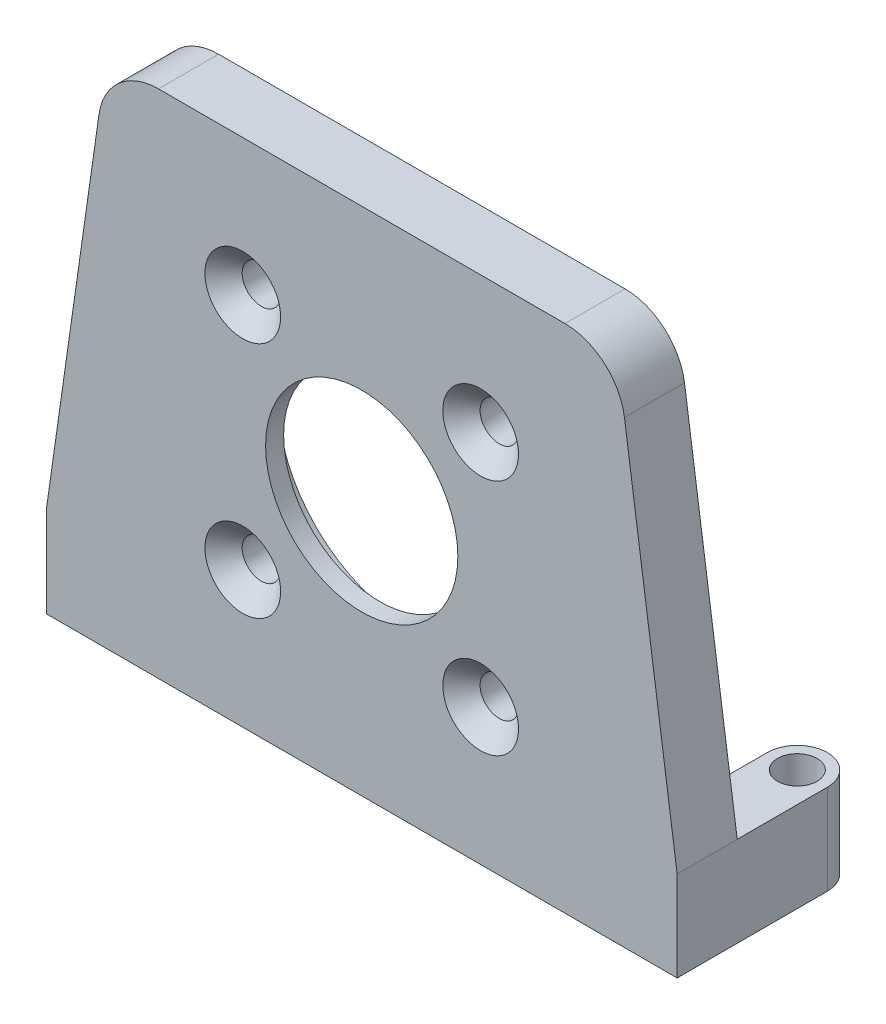
ISO-10303-21;
HEADER;
FILE_DESCRIPTION(('STEP AP214'),'2;1');
FILE_NAME('part.step','',(''),(''),'','','');
FILE_SCHEMA(('AUTOMOTIVE_DESIGN { 1 0 10303 214 1 1 1 1 }'));
ENDSEC;
DATA;
#1=APPLICATION_CONTEXT('core data for automotive mechanical design processes');
#2=APPLICATION_PROTOCOL_DEFINITION('international standard','automotive_design',2000,#1);
#3=PRODUCT_CONTEXT('',#1,'mechanical');
#4=PRODUCT('Part','Part','',(#3));
#5=PRODUCT_RELATED_PRODUCT_CATEGORY('part','',(#4));
#6=PRODUCT_DEFINITION_FORMATION('','',#4);
#7=PRODUCT_DEFINITION_CONTEXT('part definition',#1,'design');
#8=PRODUCT_DEFINITION('design','',#6,#7);
#9=PRODUCT_DEFINITION_SHAPE('','',#8);
#10=(LENGTH_UNIT() NAMED_UNIT(*) SI_UNIT(.MILLI.,.METRE.));
#11=(NAMED_UNIT(*) PLANE_ANGLE_UNIT() SI_UNIT($,.RADIAN.));
#12=(NAMED_UNIT(*) SI_UNIT($,.STERADIAN.) SOLID_ANGLE_UNIT());
#13=UNCERTAINTY_MEASURE_WITH_UNIT(LENGTH_MEASURE(1.E-05),#10,'distance_accuracy_value','');
#14=(GEOMETRIC_REPRESENTATION_CONTEXT(3) GLOBAL_UNCERTAINTY_ASSIGNED_CONTEXT((#13)) GLOBAL_UNIT_ASSIGNED_CONTEXT((#10,
#11,#12)) REPRESENTATION_CONTEXT('',''));
#15=CARTESIAN_POINT('',(0.,0.,0.));
#16=DIRECTION('',(0.,0.,1.));
#17=DIRECTION('',(1.,0.,0.));
#18=AXIS2_PLACEMENT_3D('',#15,#16,#17);
#19=CARTESIAN_POINT('',(26.25,21.25,5.));
#20=DIRECTION('',(0.,0.,-1.));
#21=DIRECTION('',(-1.,0.,0.));
#22=AXIS2_PLACEMENT_3D('',#19,#20,#21);
#23=CYLINDRICAL_SURFACE('',#22,8.);
#24=CARTESIAN_POINT('',(26.25,21.25,5.));
#25=DIRECTION('',(0.,0.,1.));
#26=DIRECTION('',(1.,0.,0.));
#27=AXIS2_PLACEMENT_3D('',#24,#25,#26);
#28=CIRCLE('',#27,8.);
#29=CARTESIAN_POINT('',(34.25,21.25,5.));
#30=VERTEX_POINT('',#29);
#31=EDGE_CURVE('E252',#30,#30,#28,.T.);
#32=ORIENTED_EDGE('',*,*,#31,.T.);
#33=EDGE_LOOP('',(#32));
#34=FACE_BOUND('',#33,.T.);
#35=CARTESIAN_POINT('',(26.25,21.25,3.5));
#36=DIRECTION('',(0.,0.,-1.));
#37=DIRECTION('',(-1.,0.,0.));
#38=AXIS2_PLACEMENT_3D('',#35,#36,#37);
#39=CIRCLE('',#38,8.);
#40=CARTESIAN_POINT('',(18.25,21.25,3.5));
#41=VERTEX_POINT('',#40);
#42=EDGE_CURVE('E51',#41,#41,#39,.T.);
#43=ORIENTED_EDGE('',*,*,#42,.T.);
#44=EDGE_LOOP('',(#43));
#45=FACE_BOUND('',#44,.T.);
#46=ADVANCED_FACE('F47',(#34,#45),#23,.F.);
#47=CARTESIAN_POINT('',(36.1494949366117,31.1494949366117,5.));
#48=DIRECTION('',(0.,0.,1.));
#49=DIRECTION('',(1.,0.,0.));
#50=AXIS2_PLACEMENT_3D('',#47,#48,#49);
#51=CYLINDRICAL_SURFACE('',#50,1.6);
#52=CARTESIAN_POINT('',(36.1494949366117,31.1494949366117,3.45));
#53=DIRECTION('',(0.,0.,1.));
#54=DIRECTION('',(1.,0.,0.));
#55=AXIS2_PLACEMENT_3D('',#52,#53,#54);
#56=CIRCLE('',#55,1.6);
#57=CARTESIAN_POINT('',(37.7494949366117,31.1494949366117,3.45));
#58=VERTEX_POINT('',#57);
#59=EDGE_CURVE('E200',#58,#58,#56,.T.);
#60=ORIENTED_EDGE('',*,*,#59,.T.);
#61=EDGE_LOOP('',(#60));
#62=FACE_BOUND('',#61,.T.);
#63=CARTESIAN_POINT('',(36.1494949366117,31.1494949366117,1.));
#64=DIRECTION('',(0.,0.,-1.));
#65=DIRECTION('',(-1.,0.,0.));
#66=AXIS2_PLACEMENT_3D('',#63,#64,#65);
#67=CIRCLE('',#66,1.6);
#68=CARTESIAN_POINT('',(34.5494949366117,31.1494949366117,1.));
#69=VERTEX_POINT('',#68);
#70=EDGE_CURVE('E480',#69,#69,#67,.F.);
#71=ORIENTED_EDGE('',*,*,#70,.F.);
#72=EDGE_LOOP('',(#71));
#73=FACE_BOUND('',#72,.T.);
#74=ADVANCED_FACE('F387',(#62,#73),#51,.F.);
#75=CARTESIAN_POINT('',(16.3505050633883,11.3505050633883,5.));
#76=DIRECTION('',(0.,0.,1.));
#77=DIRECTION('',(1.,0.,0.));
#78=AXIS2_PLACEMENT_3D('',#75,#76,#77);
#79=CYLINDRICAL_SURFACE('',#78,1.6);
#80=CARTESIAN_POINT('',(16.3505050633883,11.3505050633883,3.45));
#81=DIRECTION('',(0.,0.,1.));
#82=DIRECTION('',(1.,0.,0.));
#83=AXIS2_PLACEMENT_3D('',#80,#81,#82);
#84=CIRCLE('',#83,1.6);
#85=CARTESIAN_POINT('',(17.9505050633883,11.3505050633883,3.45));
#86=VERTEX_POINT('',#85);
#87=EDGE_CURVE('E194',#86,#86,#84,.T.);
#88=ORIENTED_EDGE('',*,*,#87,.T.);
#89=EDGE_LOOP('',(#88));
#90=FACE_BOUND('',#89,.T.);
#91=CARTESIAN_POINT('',(16.3505050633883,11.3505050633883,1.));
#92=DIRECTION('',(0.,0.,-1.));
#93=DIRECTION('',(-1.,0.,0.));
#94=AXIS2_PLACEMENT_3D('',#91,#92,#93);
#95=CIRCLE('',#94,1.6);
#96=CARTESIAN_POINT('',(14.7505050633883,11.3505050633883,1.));
#97=VERTEX_POINT('',#96);
#98=EDGE_CURVE('E478',#97,#97,#95,.F.);
#99=ORIENTED_EDGE('',*,*,#98,.F.);
#100=EDGE_LOOP('',(#99));
#101=FACE_BOUND('',#100,.T.);
#102=ADVANCED_FACE('F393',(#90,#101),#79,.F.);
#103=CARTESIAN_POINT('',(36.1494949366117,11.3505050633883,5.));
#104=DIRECTION('',(0.,0.,1.));
#105=DIRECTION('',(1.,0.,0.));
#106=AXIS2_PLACEMENT_3D('',#103,#104,#105);
#107=CYLINDRICAL_SURFACE('',#106,1.6);
#108=CARTESIAN_POINT('',(36.1494949366117,11.3505050633883,3.45));
#109=DIRECTION('',(0.,0.,1.));
#110=DIRECTION('',(1.,0.,0.));
#111=AXIS2_PLACEMENT_3D('',#108,#109,#110);
#112=CIRCLE('',#111,1.6);
#113=CARTESIAN_POINT('',(37.7494949366117,11.3505050633883,3.45));
#114=VERTEX_POINT('',#113);
#115=EDGE_CURVE('E188',#114,#114,#112,.T.);
#116=ORIENTED_EDGE('',*,*,#115,.T.);
#117=EDGE_LOOP('',(#116));
#118=FACE_BOUND('',#117,.T.);
#119=CARTESIAN_POINT('',(36.1494949366117,11.3505050633883,1.));
#120=DIRECTION('',(0.,0.,-1.));
#121=DIRECTION('',(-1.,0.,0.));
#122=AXIS2_PLACEMENT_3D('',#119,#120,#121);
#123=CIRCLE('',#122,1.6);
#124=CARTESIAN_POINT('',(34.5494949366117,11.3505050633883,1.));
#125=VERTEX_POINT('',#124);
#126=EDGE_CURVE('E481',#125,#125,#123,.F.);
#127=ORIENTED_EDGE('',*,*,#126,.F.);
#128=EDGE_LOOP('',(#127));
#129=FACE_BOUND('',#128,.T.);
#130=ADVANCED_FACE('F459',(#118,#129),#107,.F.);
#131=CARTESIAN_POINT('',(16.3505050633883,31.1494949366117,5.));
#132=DIRECTION('',(0.,0.,1.));
#133=DIRECTION('',(1.,0.,0.));
#134=AXIS2_PLACEMENT_3D('',#131,#132,#133);
#135=CYLINDRICAL_SURFACE('',#134,1.6);
#136=CARTESIAN_POINT('',(16.3505050633883,31.1494949366117,3.45));
#137=DIRECTION('',(0.,0.,1.));
#138=DIRECTION('',(1.,0.,0.));
#139=AXIS2_PLACEMENT_3D('',#136,#137,#138);
#140=CIRCLE('',#139,1.6);
#141=CARTESIAN_POINT('',(17.9505050633883,31.1494949366117,3.45));
#142=VERTEX_POINT('',#141);
#143=EDGE_CURVE('E182',#142,#142,#140,.T.);
#144=ORIENTED_EDGE('',*,*,#143,.T.);
#145=EDGE_LOOP('',(#144));
#146=FACE_BOUND('',#145,.T.);
#147=CARTESIAN_POINT('',(16.3505050633883,31.1494949366117,1.));
#148=DIRECTION('',(0.,0.,-1.));
#149=DIRECTION('',(-1.,0.,0.));
#150=AXIS2_PLACEMENT_3D('',#147,#148,#149);
#151=CIRCLE('',#150,1.6);
#152=CARTESIAN_POINT('',(14.7505050633883,31.1494949366117,1.));
#153=VERTEX_POINT('',#152);
#154=EDGE_CURVE('E266',#153,#153,#151,.F.);
#155=ORIENTED_EDGE('',*,*,#154,.F.);
#156=EDGE_LOOP('',(#155));
#157=FACE_BOUND('',#156,.T.);
#158=ADVANCED_FACE('F406',(#146,#157),#135,.F.);
#159=CARTESIAN_POINT('',(9.33647700847534,37.5,0.));
#160=DIRECTION('',(0.,0.,-1.));
#161=DIRECTION('',(-1.,0.,0.));
#162=AXIS2_PLACEMENT_3D('',#159,#160,#161);
#163=PLANE('',#162);
#164=CARTESIAN_POINT('',(26.25,21.25,0.));
#165=DIRECTION('',(0.,0.,-1.));
#166=DIRECTION('',(-1.,0.,0.));
#167=AXIS2_PLACEMENT_3D('',#164,#165,#166);
#168=CIRCLE('',#167,18.25);
#169=CARTESIAN_POINT('',(8.,21.25,0.));
#170=VERTEX_POINT('',#169);
#171=EDGE_CURVE('E535',#170,#170,#168,.T.);
#172=ORIENTED_EDGE('',*,*,#171,.F.);
#173=EDGE_LOOP('',(#172));
#174=FACE_BOUND('',#173,.T.);
#175=DIRECTION('',(0.,-1.,0.));
#176=VECTOR('',#175,1.);
#177=CARTESIAN_POINT('',(5.,7.5,0.));
#178=LINE('',#177,#176);
#179=CARTESIAN_POINT('',(5.,7.5,0.));
#180=VERTEX_POINT('',#179);
#181=CARTESIAN_POINT('',(5.,0.,0.));
#182=VERTEX_POINT('',#181);
#183=EDGE_CURVE('E224',#180,#182,#178,.T.);
#184=ORIENTED_EDGE('',*,*,#183,.F.);
#185=DIRECTION('',(-1.,0.,0.));
#186=VECTOR('',#185,1.);
#187=CARTESIAN_POINT('',(0.,7.5,0.));
#188=LINE('',#187,#186);
#189=CARTESIAN_POINT('',(0.,7.5,0.));
#190=VERTEX_POINT('',#189);
#191=EDGE_CURVE('E215',#180,#190,#188,.T.);
#192=ORIENTED_EDGE('',*,*,#191,.T.);
#193=DIRECTION('',(-0.14142135623731,-0.989949493661166,0.));
#194=VECTOR('',#193,1.);
#195=CARTESIAN_POINT('',(0.,7.5,0.));
#196=LINE('',#195,#194);
#197=CARTESIAN_POINT('',(4.38672954016951,38.2071067811866,0.));
#198=VERTEX_POINT('',#197);
#199=EDGE_CURVE('E279',#198,#190,#196,.T.);
#200=ORIENTED_EDGE('',*,*,#199,.F.);
#201=CARTESIAN_POINT('',(9.33647700847534,37.5,0.));
#202=DIRECTION('',(0.,0.,1.));
#203=DIRECTION('',(-1.,0.,0.));
#204=AXIS2_PLACEMENT_3D('',#201,#202,#203);
#205=CIRCLE('',#204,5.);
#206=CARTESIAN_POINT('',(9.33647700847534,42.5,0.));
#207=VERTEX_POINT('',#206);
#208=EDGE_CURVE('E277',#207,#198,#205,.T.);
#209=ORIENTED_EDGE('',*,*,#208,.F.);
#210=DIRECTION('',(-1.,0.,0.));
#211=VECTOR('',#210,1.);
#212=CARTESIAN_POINT('',(9.33647700847534,42.5,0.));
#213=LINE('',#212,#211);
#214=CARTESIAN_POINT('',(43.1635229915247,42.5,0.));
#215=VERTEX_POINT('',#214);
#216=EDGE_CURVE('E275',#215,#207,#213,.T.);
#217=ORIENTED_EDGE('',*,*,#216,.F.);
#218=CARTESIAN_POINT('',(43.1635229915247,37.5,0.));
#219=DIRECTION('',(0.,0.,1.));
#220=DIRECTION('',(1.,0.,0.));
#221=AXIS2_PLACEMENT_3D('',#218,#219,#220);
#222=CIRCLE('',#221,5.);
#223=CARTESIAN_POINT('',(48.1132704598305,38.2071067811866,0.));
#224=VERTEX_POINT('',#223);
#225=EDGE_CURVE('E273',#224,#215,#222,.T.);
#226=ORIENTED_EDGE('',*,*,#225,.F.);
#227=DIRECTION('',(-0.141421356237309,0.989949493661166,0.));
#228=VECTOR('',#227,1.);
#229=CARTESIAN_POINT('',(52.5,7.5,0.));
#230=LINE('',#229,#228);
#231=CARTESIAN_POINT('',(52.5,7.5,0.));
#232=VERTEX_POINT('',#231);
#233=EDGE_CURVE('E265',#232,#224,#230,.T.);
#234=ORIENTED_EDGE('',*,*,#233,.F.);
#235=DIRECTION('',(-1.,0.,0.));
#236=VECTOR('',#235,1.);
#237=CARTESIAN_POINT('',(52.5,7.5,0.));
#238=LINE('',#237,#236);
#239=CARTESIAN_POINT('',(47.5,7.5,0.));
#240=VERTEX_POINT('',#239);
#241=EDGE_CURVE('E236',#232,#240,#238,.T.);
#242=ORIENTED_EDGE('',*,*,#241,.T.);
#243=DIRECTION('',(0.,-1.,0.));
#244=VECTOR('',#243,1.);
#245=CARTESIAN_POINT('',(47.5,7.5,0.));
#246=LINE('',#245,#244);
#247=CARTESIAN_POINT('',(47.5,0.,0.));
#248=VERTEX_POINT('',#247);
#249=EDGE_CURVE('E246',#240,#248,#246,.T.);
#250=ORIENTED_EDGE('',*,*,#249,.T.);
#251=DIRECTION('',(1.,0.,0.));
#252=VECTOR('',#251,1.);
#253=CARTESIAN_POINT('',(0.,0.,0.));
#254=LINE('',#253,#252);
#255=EDGE_CURVE('E70',#182,#248,#254,.T.);
#256=ORIENTED_EDGE('',*,*,#255,.F.);
#257=EDGE_LOOP('',(#184,#192,#200,#209,#217,#226,#234,#242,#250,#256));
#258=FACE_BOUND('',#257,.T.);
#259=ADVANCED_FACE('F321',(#174,#258),#163,.T.);
#260=CARTESIAN_POINT('',(9.33647700847534,37.5,5.));
#261=DIRECTION('',(0.,0.,-1.));
#262=DIRECTION('',(-1.,0.,0.));
#263=AXIS2_PLACEMENT_3D('',#260,#261,#262);
#264=PLANE('',#263);
#265=CARTESIAN_POINT('',(16.3505050633883,31.1494949366117,5.));
#266=DIRECTION('',(0.,0.,1.));
#267=DIRECTION('',(1.,0.,0.));
#268=AXIS2_PLACEMENT_3D('',#265,#266,#267);
#269=CIRCLE('',#268,3.15);
#270=CARTESIAN_POINT('',(19.5005050633883,31.1494949366117,5.));
#271=VERTEX_POINT('',#270);
#272=EDGE_CURVE('E179',#271,#271,#269,.T.);
#273=ORIENTED_EDGE('',*,*,#272,.F.);
#274=EDGE_LOOP('',(#273));
#275=FACE_BOUND('',#274,.T.);
#276=CARTESIAN_POINT('',(36.1494949366117,11.3505050633883,5.));
#277=DIRECTION('',(0.,0.,1.));
#278=DIRECTION('',(1.,0.,0.));
#279=AXIS2_PLACEMENT_3D('',#276,#277,#278);
#280=CIRCLE('',#279,3.15);
#281=CARTESIAN_POINT('',(39.2994949366117,11.3505050633883,5.));
#282=VERTEX_POINT('',#281);
#283=EDGE_CURVE('E185',#282,#282,#280,.T.);
#284=ORIENTED_EDGE('',*,*,#283,.F.);
#285=EDGE_LOOP('',(#284));
#286=FACE_BOUND('',#285,.T.);
#287=CARTESIAN_POINT('',(16.3505050633883,11.3505050633883,5.));
#288=DIRECTION('',(0.,0.,1.));
#289=DIRECTION('',(1.,0.,0.));
#290=AXIS2_PLACEMENT_3D('',#287,#288,#289);
#291=CIRCLE('',#290,3.15);
#292=CARTESIAN_POINT('',(19.5005050633883,11.3505050633883,5.));
#293=VERTEX_POINT('',#292);
#294=EDGE_CURVE('E191',#293,#293,#291,.T.);
#295=ORIENTED_EDGE('',*,*,#294,.F.);
#296=EDGE_LOOP('',(#295));
#297=FACE_BOUND('',#296,.T.);
#298=CARTESIAN_POINT('',(36.1494949366117,31.1494949366117,5.));
#299=DIRECTION('',(0.,0.,1.));
#300=DIRECTION('',(1.,0.,0.));
#301=AXIS2_PLACEMENT_3D('',#298,#299,#300);
#302=CIRCLE('',#301,3.15);
#303=CARTESIAN_POINT('',(39.2994949366117,31.1494949366117,5.));
#304=VERTEX_POINT('',#303);
#305=EDGE_CURVE('E197',#304,#304,#302,.T.);
#306=ORIENTED_EDGE('',*,*,#305,.F.);
#307=EDGE_LOOP('',(#306));
#308=FACE_BOUND('',#307,.T.);
#309=DIRECTION('',(0.,-1.,0.));
#310=VECTOR('',#309,1.);
#311=CARTESIAN_POINT('',(0.,0.,5.));
#312=LINE('',#311,#310);
#313=CARTESIAN_POINT('',(0.,7.5,5.));
#314=VERTEX_POINT('',#313);
#315=CARTESIAN_POINT('',(0.,0.,5.));
#316=VERTEX_POINT('',#315);
#317=EDGE_CURVE('E283',#314,#316,#312,.T.);
#318=ORIENTED_EDGE('',*,*,#317,.T.);
#319=DIRECTION('',(1.,0.,0.));
#320=VECTOR('',#319,1.);
#321=CARTESIAN_POINT('',(0.,0.,5.));
#322=LINE('',#321,#320);
#323=CARTESIAN_POINT('',(52.5,0.,5.));
#324=VERTEX_POINT('',#323);
#325=EDGE_CURVE('E358',#316,#324,#322,.T.);
#326=ORIENTED_EDGE('',*,*,#325,.T.);
#327=DIRECTION('',(0.,1.,0.));
#328=VECTOR('',#327,1.);
#329=CARTESIAN_POINT('',(52.5,0.,5.));
#330=LINE('',#329,#328);
#331=CARTESIAN_POINT('',(52.5,7.5,5.));
#332=VERTEX_POINT('',#331);
#333=EDGE_CURVE('E340',#324,#332,#330,.T.);
#334=ORIENTED_EDGE('',*,*,#333,.T.);
#335=DIRECTION('',(-0.141421356237309,0.989949493661166,0.));
#336=VECTOR('',#335,1.);
#337=CARTESIAN_POINT('',(52.5,7.5,5.));
#338=LINE('',#337,#336);
#339=CARTESIAN_POINT('',(48.1132704598305,38.2071067811866,5.));
#340=VERTEX_POINT('',#339);
#341=EDGE_CURVE('E336',#332,#340,#338,.T.);
#342=ORIENTED_EDGE('',*,*,#341,.T.);
#343=CARTESIAN_POINT('',(43.1635229915247,37.5,5.));
#344=DIRECTION('',(0.,0.,1.));
#345=DIRECTION('',(1.,0.,0.));
#346=AXIS2_PLACEMENT_3D('',#343,#344,#345);
#347=CIRCLE('',#346,5.);
#348=CARTESIAN_POINT('',(43.1635229915247,42.5,5.));
#349=VERTEX_POINT('',#348);
#350=EDGE_CURVE('E332',#340,#349,#347,.T.);
#351=ORIENTED_EDGE('',*,*,#350,.T.);
#352=DIRECTION('',(-1.,0.,0.));
#353=VECTOR('',#352,1.);
#354=CARTESIAN_POINT('',(9.33647700847534,42.5,5.));
#355=LINE('',#354,#353);
#356=CARTESIAN_POINT('',(9.33647700847534,42.5,5.));
#357=VERTEX_POINT('',#356);
#358=EDGE_CURVE('E335',#349,#357,#355,.T.);
#359=ORIENTED_EDGE('',*,*,#358,.T.);
#360=CARTESIAN_POINT('',(9.33647700847534,37.5,5.));
#361=DIRECTION('',(0.,0.,1.));
#362=DIRECTION('',(-1.,0.,0.));
#363=AXIS2_PLACEMENT_3D('',#360,#361,#362);
#364=CIRCLE('',#363,5.);
#365=CARTESIAN_POINT('',(4.38672954016951,38.2071067811866,5.));
#366=VERTEX_POINT('',#365);
#367=EDGE_CURVE('E338',#357,#366,#364,.T.);
#368=ORIENTED_EDGE('',*,*,#367,.T.);
#369=DIRECTION('',(-0.14142135623731,-0.989949493661166,0.));
#370=VECTOR('',#369,1.);
#371=CARTESIAN_POINT('',(0.,7.5,5.));
#372=LINE('',#371,#370);
#373=EDGE_CURVE('E270',#366,#314,#372,.T.);
#374=ORIENTED_EDGE('',*,*,#373,.T.);
#375=EDGE_LOOP('',(#318,#326,#334,#342,#351,#359,#368,#374));
#376=FACE_BOUND('',#375,.T.);
#377=ORIENTED_EDGE('',*,*,#31,.F.);
#378=EDGE_LOOP('',(#377));
#379=FACE_BOUND('',#378,.T.);
#380=ADVANCED_FACE('F350',(#275,#286,#297,#308,#376,#379),#264,.F.);
#381=CARTESIAN_POINT('',(0.,0.,5.));
#382=DIRECTION('',(1.,0.,0.));
#383=DIRECTION('',(0.,0.,-1.));
#384=AXIS2_PLACEMENT_3D('',#381,#382,#383);
#385=PLANE('',#384);
#386=DIRECTION('',(0.,0.,-1.));
#387=VECTOR('',#386,1.);
#388=CARTESIAN_POINT('',(0.,7.5,5.));
#389=LINE('',#388,#387);
#390=EDGE_CURVE('E284',#314,#190,#389,.T.);
#391=ORIENTED_EDGE('',*,*,#390,.T.);
#392=DIRECTION('',(0.,0.,-1.));
#393=VECTOR('',#392,1.);
#394=CARTESIAN_POINT('',(0.,7.5,0.));
#395=LINE('',#394,#393);
#396=CARTESIAN_POINT('',(0.,7.5,-7.5));
#397=VERTEX_POINT('',#396);
#398=EDGE_CURVE('E204',#190,#397,#395,.T.);
#399=ORIENTED_EDGE('',*,*,#398,.T.);
#400=DIRECTION('',(0.,-1.,0.));
#401=VECTOR('',#400,1.);
#402=CARTESIAN_POINT('',(0.,7.5,-7.5));
#403=LINE('',#402,#401);
#404=CARTESIAN_POINT('',(0.,0.,-7.5));
#405=VERTEX_POINT('',#404);
#406=EDGE_CURVE('E219',#397,#405,#403,.T.);
#407=ORIENTED_EDGE('',*,*,#406,.T.);
#408=DIRECTION('',(0.,0.,-1.));
#409=VECTOR('',#408,1.);
#410=CARTESIAN_POINT('',(0.,0.,5.));
#411=LINE('',#410,#409);
#412=EDGE_CURVE('E11',#316,#405,#411,.T.);
#413=ORIENTED_EDGE('',*,*,#412,.F.);
#414=ORIENTED_EDGE('',*,*,#317,.F.);
#415=EDGE_LOOP('',(#391,#399,#407,#413,#414));
#416=FACE_BOUND('',#415,.T.);
#417=ADVANCED_FACE('F49',(#416),#385,.F.);
#418=CARTESIAN_POINT('',(0.,0.,5.));
#419=DIRECTION('',(0.,1.,0.));
#420=DIRECTION('',(0.,0.,1.));
#421=AXIS2_PLACEMENT_3D('',#418,#419,#420);
#422=PLANE('',#421);
#423=CARTESIAN_POINT('',(2.5,0.,-7.5));
#424=DIRECTION('',(0.,-1.,0.));
#425=DIRECTION('',(0.,0.,-1.));
#426=AXIS2_PLACEMENT_3D('',#423,#424,#425);
#427=CIRCLE('',#426,1.64999999999999);
#428=CARTESIAN_POINT('',(2.5,0.,-9.14999999999999));
#429=VERTEX_POINT('',#428);
#430=EDGE_CURVE('E431',#429,#429,#427,.T.);
#431=ORIENTED_EDGE('',*,*,#430,.F.);
#432=EDGE_LOOP('',(#431));
#433=FACE_BOUND('',#432,.T.);
#434=CARTESIAN_POINT('',(50.,0.,-7.5));
#435=DIRECTION('',(0.,-1.,0.));
#436=DIRECTION('',(0.,0.,-1.));
#437=AXIS2_PLACEMENT_3D('',#434,#435,#436);
#438=CIRCLE('',#437,1.64999999999999);
#439=CARTESIAN_POINT('',(50.,0.,-9.15));
#440=VERTEX_POINT('',#439);
#441=EDGE_CURVE('E435',#440,#440,#438,.T.);
#442=ORIENTED_EDGE('',*,*,#441,.F.);
#443=EDGE_LOOP('',(#442));
#444=FACE_BOUND('',#443,.T.);
#445=CARTESIAN_POINT('',(50.,0.,2.5));
#446=DIRECTION('',(0.,-1.,0.));
#447=DIRECTION('',(0.,0.,-1.));
#448=AXIS2_PLACEMENT_3D('',#445,#446,#447);
#449=CIRCLE('',#448,1.64999999999999);
#450=CARTESIAN_POINT('',(50.,0.,0.850000000000008));
#451=VERTEX_POINT('',#450);
#452=EDGE_CURVE('E166',#451,#451,#449,.T.);
#453=ORIENTED_EDGE('',*,*,#452,.F.);
#454=EDGE_LOOP('',(#453));
#455=FACE_BOUND('',#454,.T.);
#456=CARTESIAN_POINT('',(2.5,0.,2.5));
#457=DIRECTION('',(0.,-1.,0.));
#458=DIRECTION('',(0.,0.,-1.));
#459=AXIS2_PLACEMENT_3D('',#456,#457,#458);
#460=CIRCLE('',#459,1.64999999999999);
#461=CARTESIAN_POINT('',(2.5,0.,0.850000000000011));
#462=VERTEX_POINT('',#461);
#463=EDGE_CURVE('E165',#462,#462,#460,.T.);
#464=ORIENTED_EDGE('',*,*,#463,.F.);
#465=EDGE_LOOP('',(#464));
#466=FACE_BOUND('',#465,.T.);
#467=ORIENTED_EDGE('',*,*,#412,.T.);
#468=CARTESIAN_POINT('',(2.5,0.,-7.5));
#469=DIRECTION('',(0.,-1.,0.));
#470=DIRECTION('',(0.,0.,-1.));
#471=AXIS2_PLACEMENT_3D('',#468,#469,#470);
#472=CIRCLE('',#471,2.5);
#473=CARTESIAN_POINT('',(5.,0.,-7.5));
#474=VERTEX_POINT('',#473);
#475=EDGE_CURVE('E203',#405,#474,#472,.T.);
#476=ORIENTED_EDGE('',*,*,#475,.T.);
#477=DIRECTION('',(0.,0.,1.));
#478=VECTOR('',#477,1.);
#479=CARTESIAN_POINT('',(5.,0.,0.));
#480=LINE('',#479,#478);
#481=EDGE_CURVE('E65',#474,#182,#480,.T.);
#482=ORIENTED_EDGE('',*,*,#481,.T.);
#483=ORIENTED_EDGE('',*,*,#255,.T.);
#484=DIRECTION('',(0.,0.,-1.));
#485=VECTOR('',#484,1.);
#486=CARTESIAN_POINT('',(47.5,0.,0.));
#487=LINE('',#486,#485);
#488=CARTESIAN_POINT('',(47.5,0.,-7.5));
#489=VERTEX_POINT('',#488);
#490=EDGE_CURVE('E226',#248,#489,#487,.T.);
#491=ORIENTED_EDGE('',*,*,#490,.T.);
#492=CARTESIAN_POINT('',(50.,0.,-7.5));
#493=DIRECTION('',(0.,-1.,0.));
#494=DIRECTION('',(0.,0.,-1.));
#495=AXIS2_PLACEMENT_3D('',#492,#493,#494);
#496=CIRCLE('',#495,2.5);
#497=CARTESIAN_POINT('',(52.5,0.,-7.5));
#498=VERTEX_POINT('',#497);
#499=EDGE_CURVE('E237',#489,#498,#496,.T.);
#500=ORIENTED_EDGE('',*,*,#499,.T.);
#501=DIRECTION('',(0.,0.,-1.));
#502=VECTOR('',#501,1.);
#503=CARTESIAN_POINT('',(52.5,0.,5.));
#504=LINE('',#503,#502);
#505=EDGE_CURVE('E57',#324,#498,#504,.T.);
#506=ORIENTED_EDGE('',*,*,#505,.F.);
#507=ORIENTED_EDGE('',*,*,#325,.F.);
#508=EDGE_LOOP('',(#467,#476,#482,#483,#491,#500,#506,#507));
#509=FACE_BOUND('',#508,.T.);
#510=ADVANCED_FACE('F304',(#433,#444,#455,#466,#509),#422,.F.);
#511=CARTESIAN_POINT('',(52.5,0.,5.));
#512=DIRECTION('',(-1.,0.,0.));
#513=DIRECTION('',(0.,0.,1.));
#514=AXIS2_PLACEMENT_3D('',#511,#512,#513);
#515=PLANE('',#514);
#516=ORIENTED_EDGE('',*,*,#505,.T.);
#517=DIRECTION('',(0.,-1.,0.));
#518=VECTOR('',#517,1.);
#519=CARTESIAN_POINT('',(52.5,7.5,-7.5));
#520=LINE('',#519,#518);
#521=CARTESIAN_POINT('',(52.5,7.5,-7.5));
#522=VERTEX_POINT('',#521);
#523=EDGE_CURVE('E249',#522,#498,#520,.T.);
#524=ORIENTED_EDGE('',*,*,#523,.F.);
#525=DIRECTION('',(0.,0.,1.));
#526=VECTOR('',#525,1.);
#527=CARTESIAN_POINT('',(52.5,7.5,0.));
#528=LINE('',#527,#526);
#529=EDGE_CURVE('E233',#522,#232,#528,.T.);
#530=ORIENTED_EDGE('',*,*,#529,.T.);
#531=DIRECTION('',(0.,0.,-1.));
#532=VECTOR('',#531,1.);
#533=CARTESIAN_POINT('',(52.5,7.5,5.));
#534=LINE('',#533,#532);
#535=EDGE_CURVE('E300',#332,#232,#534,.T.);
#536=ORIENTED_EDGE('',*,*,#535,.F.);
#537=ORIENTED_EDGE('',*,*,#333,.F.);
#538=EDGE_LOOP('',(#516,#524,#530,#536,#537));
#539=FACE_BOUND('',#538,.T.);
#540=ADVANCED_FACE('F312',(#539),#515,.F.);
#541=CARTESIAN_POINT('',(52.5,7.5,5.));
#542=DIRECTION('',(-0.989949493661166,-0.141421356237309,0.));
#543=DIRECTION('',(0.141421356237309,-0.989949493661167,0.));
#544=AXIS2_PLACEMENT_3D('',#541,#542,#543);
#545=PLANE('',#544);
#546=ORIENTED_EDGE('',*,*,#233,.T.);
#547=DIRECTION('',(0.,0.,-1.));
#548=VECTOR('',#547,1.);
#549=CARTESIAN_POINT('',(48.1132704598305,38.2071067811866,5.));
#550=LINE('',#549,#548);
#551=EDGE_CURVE('E297',#340,#224,#550,.T.);
#552=ORIENTED_EDGE('',*,*,#551,.F.);
#553=ORIENTED_EDGE('',*,*,#341,.F.);
#554=ORIENTED_EDGE('',*,*,#535,.T.);
#555=EDGE_LOOP('',(#546,#552,#553,#554));
#556=FACE_BOUND('',#555,.T.);
#557=ADVANCED_FACE('F326',(#556),#545,.F.);
#558=CARTESIAN_POINT('',(43.1635229915247,37.5,5.));
#559=DIRECTION('',(0.,0.,-1.));
#560=DIRECTION('',(-1.,0.,0.));
#561=AXIS2_PLACEMENT_3D('',#558,#559,#560);
#562=CYLINDRICAL_SURFACE('',#561,5.);
#563=ORIENTED_EDGE('',*,*,#225,.T.);
#564=DIRECTION('',(0.,0.,-1.));
#565=VECTOR('',#564,1.);
#566=CARTESIAN_POINT('',(43.1635229915247,42.5,5.));
#567=LINE('',#566,#565);
#568=EDGE_CURVE('E294',#349,#215,#567,.T.);
#569=ORIENTED_EDGE('',*,*,#568,.F.);
#570=ORIENTED_EDGE('',*,*,#350,.F.);
#571=ORIENTED_EDGE('',*,*,#551,.T.);
#572=EDGE_LOOP('',(#563,#569,#570,#571));
#573=FACE_BOUND('',#572,.T.);
#574=ADVANCED_FACE('F330',(#573),#562,.T.);
#575=CARTESIAN_POINT('',(9.33647700847534,42.5,5.));
#576=DIRECTION('',(0.,-1.,0.));
#577=DIRECTION('',(0.,0.,-1.));
#578=AXIS2_PLACEMENT_3D('',#575,#576,#577);
#579=PLANE('',#578);
#580=ORIENTED_EDGE('',*,*,#216,.T.);
#581=DIRECTION('',(0.,0.,-1.));
#582=VECTOR('',#581,1.);
#583=CARTESIAN_POINT('',(9.33647700847534,42.5,5.));
#584=LINE('',#583,#582);
#585=EDGE_CURVE('E291',#357,#207,#584,.T.);
#586=ORIENTED_EDGE('',*,*,#585,.F.);
#587=ORIENTED_EDGE('',*,*,#358,.F.);
#588=ORIENTED_EDGE('',*,*,#568,.T.);
#589=EDGE_LOOP('',(#580,#586,#587,#588));
#590=FACE_BOUND('',#589,.T.);
#591=ADVANCED_FACE('F413',(#590),#579,.F.);
#592=CARTESIAN_POINT('',(9.33647700847534,37.5,5.));
#593=DIRECTION('',(0.,0.,-1.));
#594=DIRECTION('',(-1.,0.,0.));
#595=AXIS2_PLACEMENT_3D('',#592,#593,#594);
#596=CYLINDRICAL_SURFACE('',#595,5.);
#597=ORIENTED_EDGE('',*,*,#208,.T.);
#598=DIRECTION('',(0.,0.,-1.));
#599=VECTOR('',#598,1.);
#600=CARTESIAN_POINT('',(4.38672954016951,38.2071067811866,5.));
#601=LINE('',#600,#599);
#602=EDGE_CURVE('E288',#366,#198,#601,.T.);
#603=ORIENTED_EDGE('',*,*,#602,.F.);
#604=ORIENTED_EDGE('',*,*,#367,.F.);
#605=ORIENTED_EDGE('',*,*,#585,.T.);
#606=EDGE_LOOP('',(#597,#603,#604,#605));
#607=FACE_BOUND('',#606,.T.);
#608=ADVANCED_FACE('F410',(#607),#596,.T.);
#609=CARTESIAN_POINT('',(0.,7.5,5.));
#610=DIRECTION('',(0.989949493661166,-0.14142135623731,0.));
#611=DIRECTION('',(0.14142135623731,0.989949493661167,0.));
#612=AXIS2_PLACEMENT_3D('',#609,#610,#611);
#613=PLANE('',#612);
#614=ORIENTED_EDGE('',*,*,#199,.T.);
#615=ORIENTED_EDGE('',*,*,#390,.F.);
#616=ORIENTED_EDGE('',*,*,#373,.F.);
#617=ORIENTED_EDGE('',*,*,#602,.T.);
#618=EDGE_LOOP('',(#614,#615,#616,#617));
#619=FACE_BOUND('',#618,.T.);
#620=ADVANCED_FACE('F355',(#619),#613,.F.);
#621=CARTESIAN_POINT('',(50.,7.5,-7.5));
#622=DIRECTION('',(0.,-1.,0.));
#623=DIRECTION('',(0.,0.,-1.));
#624=AXIS2_PLACEMENT_3D('',#621,#622,#623);
#625=CYLINDRICAL_SURFACE('',#624,2.5);
#626=ORIENTED_EDGE('',*,*,#499,.F.);
#627=DIRECTION('',(0.,-1.,0.));
#628=VECTOR('',#627,1.);
#629=CARTESIAN_POINT('',(47.5,7.5,-7.5));
#630=LINE('',#629,#628);
#631=CARTESIAN_POINT('',(47.5,7.5,-7.5));
#632=VERTEX_POINT('',#631);
#633=EDGE_CURVE('E253',#632,#489,#630,.T.);
#634=ORIENTED_EDGE('',*,*,#633,.F.);
#635=CARTESIAN_POINT('',(50.,7.5,-7.5));
#636=DIRECTION('',(0.,-1.,0.));
#637=DIRECTION('',(0.,0.,-1.));
#638=AXIS2_PLACEMENT_3D('',#635,#636,#637);
#639=CIRCLE('',#638,2.5);
#640=EDGE_CURVE('E243',#632,#522,#639,.T.);
#641=ORIENTED_EDGE('',*,*,#640,.T.);
#642=ORIENTED_EDGE('',*,*,#523,.T.);
#643=EDGE_LOOP('',(#626,#634,#641,#642));
#644=FACE_BOUND('',#643,.T.);
#645=ADVANCED_FACE('F308',(#644),#625,.T.);
#646=CARTESIAN_POINT('',(47.5,7.5,0.));
#647=DIRECTION('',(-1.,0.,0.));
#648=DIRECTION('',(0.,0.,1.));
#649=AXIS2_PLACEMENT_3D('',#646,#647,#648);
#650=PLANE('',#649);
#651=ORIENTED_EDGE('',*,*,#490,.F.);
#652=ORIENTED_EDGE('',*,*,#249,.F.);
#653=DIRECTION('',(0.,0.,-1.));
#654=VECTOR('',#653,1.);
#655=CARTESIAN_POINT('',(47.5,7.5,0.));
#656=LINE('',#655,#654);
#657=EDGE_CURVE('E240',#240,#632,#656,.T.);
#658=ORIENTED_EDGE('',*,*,#657,.T.);
#659=ORIENTED_EDGE('',*,*,#633,.T.);
#660=EDGE_LOOP('',(#651,#652,#658,#659));
#661=FACE_BOUND('',#660,.T.);
#662=ADVANCED_FACE('F399',(#661),#650,.T.);
#663=CARTESIAN_POINT('',(50.,7.5,-7.5));
#664=DIRECTION('',(0.,-1.,0.));
#665=DIRECTION('',(0.,0.,-1.));
#666=AXIS2_PLACEMENT_3D('',#663,#664,#665);
#667=PLANE('',#666);
#668=CARTESIAN_POINT('',(50.,7.5,-7.5));
#669=DIRECTION('',(0.,-1.,0.));
#670=DIRECTION('',(0.,0.,-1.));
#671=AXIS2_PLACEMENT_3D('',#668,#669,#670);
#672=CIRCLE('',#671,1.65);
#673=CARTESIAN_POINT('',(50.,7.5,-9.15));
#674=VERTEX_POINT('',#673);
#675=EDGE_CURVE('E172',#674,#674,#672,.T.);
#676=ORIENTED_EDGE('',*,*,#675,.T.);
#677=EDGE_LOOP('',(#676));
#678=FACE_BOUND('',#677,.T.);
#679=ORIENTED_EDGE('',*,*,#529,.F.);
#680=ORIENTED_EDGE('',*,*,#640,.F.);
#681=ORIENTED_EDGE('',*,*,#657,.F.);
#682=ORIENTED_EDGE('',*,*,#241,.F.);
#683=EDGE_LOOP('',(#679,#680,#681,#682));
#684=FACE_BOUND('',#683,.T.);
#685=ADVANCED_FACE('F316',(#678,#684),#667,.F.);
#686=CARTESIAN_POINT('',(5.,7.5,0.));
#687=DIRECTION('',(1.,0.,0.));
#688=DIRECTION('',(0.,0.,-1.));
#689=AXIS2_PLACEMENT_3D('',#686,#687,#688);
#690=PLANE('',#689);
#691=ORIENTED_EDGE('',*,*,#481,.F.);
#692=DIRECTION('',(0.,-1.,0.));
#693=VECTOR('',#692,1.);
#694=CARTESIAN_POINT('',(5.,7.5,-7.5));
#695=LINE('',#694,#693);
#696=CARTESIAN_POINT('',(5.,7.5,-7.5));
#697=VERTEX_POINT('',#696);
#698=EDGE_CURVE('E227',#697,#474,#695,.T.);
#699=ORIENTED_EDGE('',*,*,#698,.F.);
#700=DIRECTION('',(0.,0.,1.));
#701=VECTOR('',#700,1.);
#702=CARTESIAN_POINT('',(5.,7.5,0.));
#703=LINE('',#702,#701);
#704=EDGE_CURVE('E212',#697,#180,#703,.T.);
#705=ORIENTED_EDGE('',*,*,#704,.T.);
#706=ORIENTED_EDGE('',*,*,#183,.T.);
#707=EDGE_LOOP('',(#691,#699,#705,#706));
#708=FACE_BOUND('',#707,.T.);
#709=ADVANCED_FACE('F366',(#708),#690,.T.);
#710=CARTESIAN_POINT('',(2.5,7.5,-7.5));
#711=DIRECTION('',(0.,-1.,0.));
#712=DIRECTION('',(0.,0.,-1.));
#713=AXIS2_PLACEMENT_3D('',#710,#711,#712);
#714=CYLINDRICAL_SURFACE('',#713,2.5);
#715=ORIENTED_EDGE('',*,*,#475,.F.);
#716=ORIENTED_EDGE('',*,*,#406,.F.);
#717=CARTESIAN_POINT('',(2.5,7.5,-7.5));
#718=DIRECTION('',(0.,-1.,0.));
#719=DIRECTION('',(0.,0.,-1.));
#720=AXIS2_PLACEMENT_3D('',#717,#718,#719);
#721=CIRCLE('',#720,2.5);
#722=EDGE_CURVE('E208',#397,#697,#721,.T.);
#723=ORIENTED_EDGE('',*,*,#722,.T.);
#724=ORIENTED_EDGE('',*,*,#698,.T.);
#725=EDGE_LOOP('',(#715,#716,#723,#724));
#726=FACE_BOUND('',#725,.T.);
#727=ADVANCED_FACE('F363',(#726),#714,.T.);
#728=CARTESIAN_POINT('',(2.5,7.5,-7.5));
#729=DIRECTION('',(0.,-1.,0.));
#730=DIRECTION('',(0.,0.,-1.));
#731=AXIS2_PLACEMENT_3D('',#728,#729,#730);
#732=PLANE('',#731);
#733=CARTESIAN_POINT('',(2.5,7.5,-7.5));
#734=DIRECTION('',(0.,-1.,0.));
#735=DIRECTION('',(0.,0.,-1.));
#736=AXIS2_PLACEMENT_3D('',#733,#734,#735);
#737=CIRCLE('',#736,1.64999999999999);
#738=CARTESIAN_POINT('',(2.5,7.5,-9.15));
#739=VERTEX_POINT('',#738);
#740=EDGE_CURVE('E491',#739,#739,#737,.T.);
#741=ORIENTED_EDGE('',*,*,#740,.T.);
#742=EDGE_LOOP('',(#741));
#743=FACE_BOUND('',#742,.T.);
#744=ORIENTED_EDGE('',*,*,#398,.F.);
#745=ORIENTED_EDGE('',*,*,#191,.F.);
#746=ORIENTED_EDGE('',*,*,#704,.F.);
#747=ORIENTED_EDGE('',*,*,#722,.F.);
#748=EDGE_LOOP('',(#744,#745,#746,#747));
#749=FACE_BOUND('',#748,.T.);
#750=ADVANCED_FACE('F370',(#743,#749),#732,.F.);
#751=CARTESIAN_POINT('',(36.1494949366117,31.1494949366117,5.));
#752=DIRECTION('',(0.,0.,1.));
#753=DIRECTION('',(1.,0.,0.));
#754=AXIS2_PLACEMENT_3D('',#751,#752,#753);
#755=CONICAL_SURFACE('',#754,3.15,0.785398163397449);
#756=ORIENTED_EDGE('',*,*,#59,.F.);
#757=EDGE_LOOP('',(#756));
#758=FACE_BOUND('',#757,.T.);
#759=ORIENTED_EDGE('',*,*,#305,.T.);
#760=EDGE_LOOP('',(#759));
#761=FACE_BOUND('',#760,.T.);
#762=ADVANCED_FACE('F372',(#758,#761),#755,.F.);
#763=CARTESIAN_POINT('',(16.3505050633883,11.3505050633883,5.));
#764=DIRECTION('',(0.,0.,1.));
#765=DIRECTION('',(1.,0.,0.));
#766=AXIS2_PLACEMENT_3D('',#763,#764,#765);
#767=CONICAL_SURFACE('',#766,3.15,0.785398163397448);
#768=ORIENTED_EDGE('',*,*,#87,.F.);
#769=EDGE_LOOP('',(#768));
#770=FACE_BOUND('',#769,.T.);
#771=ORIENTED_EDGE('',*,*,#294,.T.);
#772=EDGE_LOOP('',(#771));
#773=FACE_BOUND('',#772,.T.);
#774=ADVANCED_FACE('F379',(#770,#773),#767,.F.);
#775=CARTESIAN_POINT('',(36.1494949366117,11.3505050633883,5.));
#776=DIRECTION('',(0.,0.,1.));
#777=DIRECTION('',(1.,0.,0.));
#778=AXIS2_PLACEMENT_3D('',#775,#776,#777);
#779=CONICAL_SURFACE('',#778,3.15,0.785398163397449);
#780=ORIENTED_EDGE('',*,*,#115,.F.);
#781=EDGE_LOOP('',(#780));
#782=FACE_BOUND('',#781,.T.);
#783=ORIENTED_EDGE('',*,*,#283,.T.);
#784=EDGE_LOOP('',(#783));
#785=FACE_BOUND('',#784,.T.);
#786=ADVANCED_FACE('F455',(#782,#785),#779,.F.);
#787=CARTESIAN_POINT('',(16.3505050633883,31.1494949366117,5.));
#788=DIRECTION('',(0.,0.,1.));
#789=DIRECTION('',(1.,0.,0.));
#790=AXIS2_PLACEMENT_3D('',#787,#788,#789);
#791=CONICAL_SURFACE('',#790,3.15,0.785398163397448);
#792=ORIENTED_EDGE('',*,*,#143,.F.);
#793=EDGE_LOOP('',(#792));
#794=FACE_BOUND('',#793,.T.);
#795=ORIENTED_EDGE('',*,*,#272,.T.);
#796=EDGE_LOOP('',(#795));
#797=FACE_BOUND('',#796,.T.);
#798=ADVANCED_FACE('F447',(#794,#797),#791,.F.);
#799=CARTESIAN_POINT('',(2.5,13.,2.5));
#800=DIRECTION('',(0.,-1.,0.));
#801=DIRECTION('',(0.,0.,-1.));
#802=AXIS2_PLACEMENT_3D('',#799,#800,#801);
#803=CONICAL_SURFACE('',#802,1.65,1.02974425867665);
#804=CARTESIAN_POINT('',(2.5,13.9914200213955,2.5));
#805=VERTEX_POINT('',#804);
#806=VERTEX_LOOP('',#805);
#807=FACE_BOUND('',#806,.T.);
#808=CARTESIAN_POINT('',(2.5,13.,2.5));
#809=DIRECTION('',(0.,-1.,0.));
#810=DIRECTION('',(0.,0.,-1.));
#811=AXIS2_PLACEMENT_3D('',#808,#809,#810);
#812=CIRCLE('',#811,1.65);
#813=CARTESIAN_POINT('',(2.5,13.,0.850000000000004));
#814=VERTEX_POINT('',#813);
#815=EDGE_CURVE('E169',#814,#814,#812,.T.);
#816=ORIENTED_EDGE('',*,*,#815,.T.);
#817=EDGE_LOOP('',(#816));
#818=FACE_BOUND('',#817,.T.);
#819=ADVANCED_FACE('F441',(#807,#818),#803,.F.);
#820=CARTESIAN_POINT('',(2.5,0.,2.5));
#821=DIRECTION('',(0.,-1.,0.));
#822=DIRECTION('',(0.,0.,-1.));
#823=AXIS2_PLACEMENT_3D('',#820,#821,#822);
#824=CYLINDRICAL_SURFACE('',#823,1.64999999999999);
#825=ORIENTED_EDGE('',*,*,#815,.F.);
#826=EDGE_LOOP('',(#825));
#827=FACE_BOUND('',#826,.T.);
#828=ORIENTED_EDGE('',*,*,#463,.T.);
#829=EDGE_LOOP('',(#828));
#830=FACE_BOUND('',#829,.T.);
#831=ADVANCED_FACE('F159',(#827,#830),#824,.F.);
#832=CARTESIAN_POINT('',(50.,13.,2.5));
#833=DIRECTION('',(0.,-1.,0.));
#834=DIRECTION('',(0.,0.,-1.));
#835=AXIS2_PLACEMENT_3D('',#832,#833,#834);
#836=CONICAL_SURFACE('',#835,1.65,1.02974425867665);
#837=CARTESIAN_POINT('',(50.,13.9914200213955,2.5));
#838=VERTEX_POINT('',#837);
#839=VERTEX_LOOP('',#838);
#840=FACE_BOUND('',#839,.T.);
#841=CARTESIAN_POINT('',(50.,13.,2.5));
#842=DIRECTION('',(0.,-1.,0.));
#843=DIRECTION('',(0.,0.,-1.));
#844=AXIS2_PLACEMENT_3D('',#841,#842,#843);
#845=CIRCLE('',#844,1.65);
#846=CARTESIAN_POINT('',(50.,13.,0.850000000000001));
#847=VERTEX_POINT('',#846);
#848=EDGE_CURVE('E163',#847,#847,#845,.T.);
#849=ORIENTED_EDGE('',*,*,#848,.T.);
#850=EDGE_LOOP('',(#849));
#851=FACE_BOUND('',#850,.T.);
#852=ADVANCED_FACE('F155',(#840,#851),#836,.F.);
#853=CARTESIAN_POINT('',(50.,0.,2.5));
#854=DIRECTION('',(0.,-1.,0.));
#855=DIRECTION('',(0.,0.,-1.));
#856=AXIS2_PLACEMENT_3D('',#853,#854,#855);
#857=CYLINDRICAL_SURFACE('',#856,1.65);
#858=ORIENTED_EDGE('',*,*,#848,.F.);
#859=EDGE_LOOP('',(#858));
#860=FACE_BOUND('',#859,.T.);
#861=ORIENTED_EDGE('',*,*,#452,.T.);
#862=EDGE_LOOP('',(#861));
#863=FACE_BOUND('',#862,.T.);
#864=ADVANCED_FACE('F158',(#860,#863),#857,.F.);
#865=CARTESIAN_POINT('',(50.,0.,-7.5));
#866=DIRECTION('',(0.,-1.,0.));
#867=DIRECTION('',(0.,0.,-1.));
#868=AXIS2_PLACEMENT_3D('',#865,#866,#867);
#869=CYLINDRICAL_SURFACE('',#868,1.65);
#870=ORIENTED_EDGE('',*,*,#441,.T.);
#871=EDGE_LOOP('',(#870));
#872=FACE_BOUND('',#871,.T.);
#873=ORIENTED_EDGE('',*,*,#675,.F.);
#874=EDGE_LOOP('',(#873));
#875=FACE_BOUND('',#874,.T.);
#876=ADVANCED_FACE('F498',(#872,#875),#869,.F.);
#877=CARTESIAN_POINT('',(2.5,0.,-7.5));
#878=DIRECTION('',(0.,-1.,0.));
#879=DIRECTION('',(0.,0.,-1.));
#880=AXIS2_PLACEMENT_3D('',#877,#878,#879);
#881=CYLINDRICAL_SURFACE('',#880,1.64999999999999);
#882=ORIENTED_EDGE('',*,*,#430,.T.);
#883=EDGE_LOOP('',(#882));
#884=FACE_BOUND('',#883,.T.);
#885=ORIENTED_EDGE('',*,*,#740,.F.);
#886=EDGE_LOOP('',(#885));
#887=FACE_BOUND('',#886,.T.);
#888=ADVANCED_FACE('F500',(#884,#887),#881,.F.);
#889=CARTESIAN_POINT('',(26.25,21.25,1.));
#890=DIRECTION('',(0.,0.,-1.));
#891=DIRECTION('',(-1.,0.,0.));
#892=AXIS2_PLACEMENT_3D('',#889,#890,#891);
#893=PLANE('',#892);
#894=CARTESIAN_POINT('',(26.25,21.25,1.));
#895=DIRECTION('',(0.,0.,-1.));
#896=DIRECTION('',(-1.,0.,0.));
#897=AXIS2_PLACEMENT_3D('',#894,#895,#896);
#898=CIRCLE('',#897,11.0125);
#899=CARTESIAN_POINT('',(15.2375,21.25,1.));
#900=VERTEX_POINT('',#899);
#901=EDGE_CURVE('E533',#900,#900,#898,.T.);
#902=ORIENTED_EDGE('',*,*,#901,.F.);
#903=EDGE_LOOP('',(#902));
#904=FACE_BOUND('',#903,.T.);
#905=ORIENTED_EDGE('',*,*,#98,.T.);
#906=EDGE_LOOP('',(#905));
#907=FACE_BOUND('',#906,.T.);
#908=ORIENTED_EDGE('',*,*,#154,.T.);
#909=EDGE_LOOP('',(#908));
#910=FACE_BOUND('',#909,.T.);
#911=CARTESIAN_POINT('',(26.25,21.25,1.));
#912=DIRECTION('',(0.,0.,-1.));
#913=DIRECTION('',(-1.,0.,0.));
#914=AXIS2_PLACEMENT_3D('',#911,#912,#913);
#915=CIRCLE('',#914,18.25);
#916=CARTESIAN_POINT('',(8.,21.25,1.));
#917=VERTEX_POINT('',#916);
#918=EDGE_CURVE('E539',#917,#917,#915,.T.);
#919=ORIENTED_EDGE('',*,*,#918,.T.);
#920=EDGE_LOOP('',(#919));
#921=FACE_BOUND('',#920,.T.);
#922=ORIENTED_EDGE('',*,*,#126,.T.);
#923=EDGE_LOOP('',(#922));
#924=FACE_BOUND('',#923,.T.);
#925=ORIENTED_EDGE('',*,*,#70,.T.);
#926=EDGE_LOOP('',(#925));
#927=FACE_BOUND('',#926,.T.);
#928=ADVANCED_FACE('F507',(#904,#907,#910,#921,#924,#927),#893,.T.);
#929=CARTESIAN_POINT('',(26.25,21.25,1.));
#930=DIRECTION('',(0.,0.,-1.));
#931=DIRECTION('',(-1.,0.,0.));
#932=AXIS2_PLACEMENT_3D('',#929,#930,#931);
#933=CYLINDRICAL_SURFACE('',#932,18.25);
#934=ORIENTED_EDGE('',*,*,#918,.F.);
#935=EDGE_LOOP('',(#934));
#936=FACE_BOUND('',#935,.T.);
#937=ORIENTED_EDGE('',*,*,#171,.T.);
#938=EDGE_LOOP('',(#937));
#939=FACE_BOUND('',#938,.T.);
#940=ADVANCED_FACE('F511',(#936,#939),#933,.F.);
#941=CARTESIAN_POINT('',(26.25,21.25,3.5));
#942=DIRECTION('',(0.,0.,-1.));
#943=DIRECTION('',(-1.,0.,0.));
#944=AXIS2_PLACEMENT_3D('',#941,#942,#943);
#945=CYLINDRICAL_SURFACE('',#944,11.0125);
#946=CARTESIAN_POINT('',(26.25,21.25,3.5));
#947=DIRECTION('',(0.,0.,-1.));
#948=DIRECTION('',(-1.,0.,0.));
#949=AXIS2_PLACEMENT_3D('',#946,#947,#948);
#950=CIRCLE('',#949,11.0125);
#951=CARTESIAN_POINT('',(15.2375,21.25,3.5));
#952=VERTEX_POINT('',#951);
#953=EDGE_CURVE('E532',#952,#952,#950,.T.);
#954=ORIENTED_EDGE('',*,*,#953,.F.);
#955=EDGE_LOOP('',(#954));
#956=FACE_BOUND('',#955,.T.);
#957=ORIENTED_EDGE('',*,*,#901,.T.);
#958=EDGE_LOOP('',(#957));
#959=FACE_BOUND('',#958,.T.);
#960=ADVANCED_FACE('F514',(#956,#959),#945,.F.);
#961=CARTESIAN_POINT('',(26.25,21.25,3.5));
#962=DIRECTION('',(0.,0.,-1.));
#963=DIRECTION('',(-1.,0.,0.));
#964=AXIS2_PLACEMENT_3D('',#961,#962,#963);
#965=PLANE('',#964);
#966=ORIENTED_EDGE('',*,*,#42,.F.);
#967=EDGE_LOOP('',(#966));
#968=FACE_BOUND('',#967,.T.);
#969=ORIENTED_EDGE('',*,*,#953,.T.);
#970=EDGE_LOOP('',(#969));
#971=FACE_BOUND('',#970,.T.);
#972=ADVANCED_FACE('F521',(#968,#971),#965,.T.);
#973=CLOSED_SHELL('',(#46,#74,#102,#130,#158,#259,#380,#417,#510,#540,#557,#574,#591,#608,#620,
#645,#662,#685,#709,#727,#750,#762,#774,#786,#798,#819,#831,#852,#864,#876,#888,#928,#940,#960,#972));
#974=MANIFOLD_SOLID_BREP('B2',#973);
#975=ADVANCED_BREP_SHAPE_REPRESENTATION('',(#18,#974),#14);
#976=SHAPE_DEFINITION_REPRESENTATION(#9,#975);
ENDSEC;
END-ISO-10303-21;
